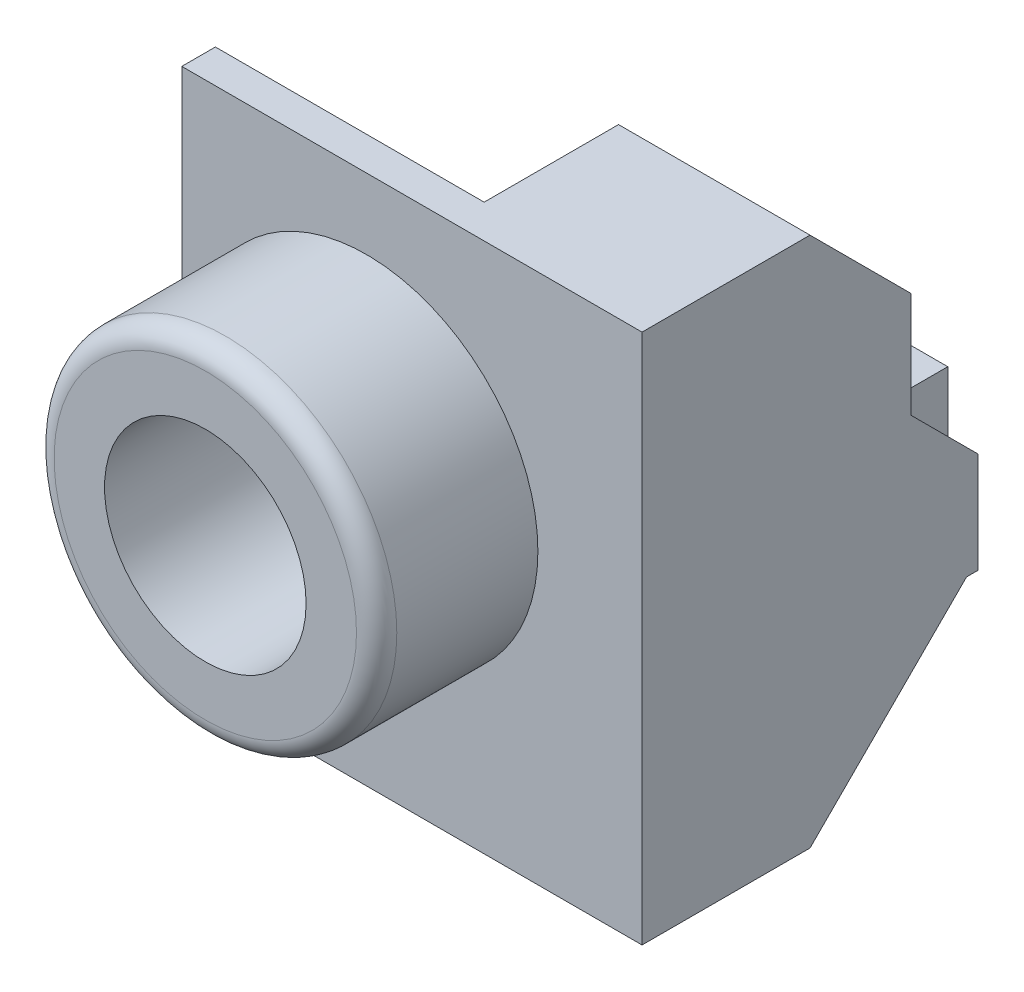
ISO-10303-21;
HEADER;
FILE_DESCRIPTION(('STEP AP214'),'2;1');
FILE_NAME('part.step','',(''),(''),'','','');
FILE_SCHEMA(('AUTOMOTIVE_DESIGN { 1 0 10303 214 1 1 1 1 }'));
ENDSEC;
DATA;
#1=APPLICATION_CONTEXT('core data for automotive mechanical design processes');
#2=APPLICATION_PROTOCOL_DEFINITION('international standard','automotive_design',2000,#1);
#3=PRODUCT_CONTEXT('',#1,'mechanical');
#4=PRODUCT('Part','Part','',(#3));
#5=PRODUCT_RELATED_PRODUCT_CATEGORY('part','',(#4));
#6=PRODUCT_DEFINITION_FORMATION('','',#4);
#7=PRODUCT_DEFINITION_CONTEXT('part definition',#1,'design');
#8=PRODUCT_DEFINITION('design','',#6,#7);
#9=PRODUCT_DEFINITION_SHAPE('','',#8);
#10=(LENGTH_UNIT() NAMED_UNIT(*) SI_UNIT(.MILLI.,.METRE.));
#11=(NAMED_UNIT(*) PLANE_ANGLE_UNIT() SI_UNIT($,.RADIAN.));
#12=(NAMED_UNIT(*) SI_UNIT($,.STERADIAN.) SOLID_ANGLE_UNIT());
#13=UNCERTAINTY_MEASURE_WITH_UNIT(LENGTH_MEASURE(1.E-05),#10,'distance_accuracy_value','');
#14=(GEOMETRIC_REPRESENTATION_CONTEXT(3) GLOBAL_UNCERTAINTY_ASSIGNED_CONTEXT((#13)) GLOBAL_UNIT_ASSIGNED_CONTEXT((#10,
#11,#12)) REPRESENTATION_CONTEXT('',''));
#15=CARTESIAN_POINT('',(0.,0.,0.));
#16=DIRECTION('',(0.,0.,1.));
#17=DIRECTION('',(1.,0.,0.));
#18=AXIS2_PLACEMENT_3D('',#15,#16,#17);
#19=CARTESIAN_POINT('',(0.,0.,-8.));
#20=DIRECTION('',(0.,0.,-1.));
#21=DIRECTION('',(-1.,0.,0.));
#22=AXIS2_PLACEMENT_3D('',#19,#20,#21);
#23=PLANE('',#22);
#24=DIRECTION('',(-1.,0.,0.));
#25=VECTOR('',#24,1.);
#26=CARTESIAN_POINT('',(2.91513169682799,-5.461534595663,-8.));
#27=LINE('',#26,#25);
#28=CARTESIAN_POINT('',(8.19999999999999,-5.461534595663,-8.));
#29=VERTEX_POINT('',#28);
#30=CARTESIAN_POINT('',(2.49999999999999,-5.461534595663,-8.));
#31=VERTEX_POINT('',#30);
#32=EDGE_CURVE('E183',#29,#31,#27,.T.);
#33=ORIENTED_EDGE('',*,*,#32,.T.);
#34=DIRECTION('',(0.,1.,0.));
#35=VECTOR('',#34,1.);
#36=CARTESIAN_POINT('',(2.49999999999999,0.680000000000005,-8.));
#37=LINE('',#36,#35);
#38=CARTESIAN_POINT('',(2.49999999999999,-2.31999999999999,-8.));
#39=VERTEX_POINT('',#38);
#40=EDGE_CURVE('E262',#31,#39,#37,.T.);
#41=ORIENTED_EDGE('',*,*,#40,.T.);
#42=DIRECTION('',(1.,0.,0.));
#43=VECTOR('',#42,1.);
#44=CARTESIAN_POINT('',(5.49999999999999,-2.31999999999999,-8.));
#45=LINE('',#44,#43);
#46=CARTESIAN_POINT('',(8.19999999999999,-2.32,-8.));
#47=VERTEX_POINT('',#46);
#48=EDGE_CURVE('E330',#39,#47,#45,.T.);
#49=ORIENTED_EDGE('',*,*,#48,.T.);
#50=DIRECTION('',(0.,1.,0.));
#51=VECTOR('',#50,1.);
#52=CARTESIAN_POINT('',(8.19999999999999,0.,-8.));
#53=LINE('',#52,#51);
#54=EDGE_CURVE('E188',#29,#47,#53,.T.);
#55=ORIENTED_EDGE('',*,*,#54,.F.);
#56=EDGE_LOOP('',(#33,#41,#49,#55));
#57=FACE_BOUND('',#56,.T.);
#58=ADVANCED_FACE('F44',(#57),#23,.T.);
#59=CARTESIAN_POINT('',(0.,0.,-1.));
#60=DIRECTION('',(0.,0.,-1.));
#61=DIRECTION('',(-1.,0.,0.));
#62=AXIS2_PLACEMENT_3D('',#59,#60,#61);
#63=PLANE('',#62);
#64=CARTESIAN_POINT('',(0.,-6.52,-1.));
#65=DIRECTION('',(0.,0.,1.));
#66=DIRECTION('',(1.,0.,0.));
#67=AXIS2_PLACEMENT_3D('',#64,#65,#66);
#68=CIRCLE('',#67,1.);
#69=CARTESIAN_POINT('',(0.999999999999993,-6.52,-1.));
#70=VERTEX_POINT('',#69);
#71=EDGE_CURVE('E272',#70,#70,#68,.T.);
#72=ORIENTED_EDGE('',*,*,#71,.T.);
#73=EDGE_LOOP('',(#72));
#74=FACE_BOUND('',#73,.T.);
#75=DIRECTION('',(1.,0.,0.));
#76=VECTOR('',#75,1.);
#77=CARTESIAN_POINT('',(5.49999999999999,0.680000000000005,-1.));
#78=LINE('',#77,#76);
#79=CARTESIAN_POINT('',(-5.5,0.680000000000005,-1.));
#80=VERTEX_POINT('',#79);
#81=CARTESIAN_POINT('',(2.49999999999999,0.680000000000005,-1.));
#82=VERTEX_POINT('',#81);
#83=EDGE_CURVE('E299',#80,#82,#78,.T.);
#84=ORIENTED_EDGE('',*,*,#83,.T.);
#85=DIRECTION('',(0.,1.,0.));
#86=VECTOR('',#85,1.);
#87=CARTESIAN_POINT('',(2.49999999999999,0.680000000000005,-1.));
#88=LINE('',#87,#86);
#89=CARTESIAN_POINT('',(2.49999999999999,-15.12,-1.));
#90=VERTEX_POINT('',#89);
#91=EDGE_CURVE('E248',#90,#82,#88,.T.);
#92=ORIENTED_EDGE('',*,*,#91,.F.);
#93=DIRECTION('',(-1.,0.,0.));
#94=VECTOR('',#93,1.);
#95=CARTESIAN_POINT('',(5.49999999999999,-15.12,-1.));
#96=LINE('',#95,#94);
#97=CARTESIAN_POINT('',(-5.5,-15.12,-1.));
#98=VERTEX_POINT('',#97);
#99=EDGE_CURVE('E292',#90,#98,#96,.T.);
#100=ORIENTED_EDGE('',*,*,#99,.T.);
#101=DIRECTION('',(0.,1.,0.));
#102=VECTOR('',#101,1.);
#103=CARTESIAN_POINT('',(-5.5,0.680000000000005,-1.));
#104=LINE('',#103,#102);
#105=EDGE_CURVE('E295',#98,#80,#104,.T.);
#106=ORIENTED_EDGE('',*,*,#105,.T.);
#107=EDGE_LOOP('',(#84,#92,#100,#106));
#108=FACE_BOUND('',#107,.T.);
#109=ADVANCED_FACE('F404',(#74,#108),#63,.T.);
#110=CARTESIAN_POINT('',(0.,-6.52,4.8));
#111=DIRECTION('',(0.,0.,-1.));
#112=DIRECTION('',(-1.,0.,0.));
#113=AXIS2_PLACEMENT_3D('',#110,#111,#112);
#114=CYLINDRICAL_SURFACE('',#113,5.1);
#115=CARTESIAN_POINT('',(0.,-6.52,4.2));
#116=DIRECTION('',(0.,0.,1.));
#117=DIRECTION('',(1.,0.,0.));
#118=AXIS2_PLACEMENT_3D('',#115,#116,#117);
#119=CIRCLE('',#118,5.1);
#120=CARTESIAN_POINT('',(5.09999999999999,-6.52,4.2));
#121=VERTEX_POINT('',#120);
#122=EDGE_CURVE('E326',#121,#121,#119,.F.);
#123=ORIENTED_EDGE('',*,*,#122,.T.);
#124=EDGE_LOOP('',(#123));
#125=FACE_BOUND('',#124,.T.);
#126=CARTESIAN_POINT('',(0.,-6.52,0.));
#127=DIRECTION('',(0.,0.,1.));
#128=DIRECTION('',(1.,0.,0.));
#129=AXIS2_PLACEMENT_3D('',#126,#127,#128);
#130=CIRCLE('',#129,5.1);
#131=CARTESIAN_POINT('',(5.09999999999999,-6.52,0.));
#132=VERTEX_POINT('',#131);
#133=EDGE_CURVE('E318',#132,#132,#130,.T.);
#134=ORIENTED_EDGE('',*,*,#133,.T.);
#135=EDGE_LOOP('',(#134));
#136=FACE_BOUND('',#135,.T.);
#137=ADVANCED_FACE('F440',(#125,#136),#114,.T.);
#138=CARTESIAN_POINT('',(0.,-6.52,4.8));
#139=DIRECTION('',(0.,0.,1.));
#140=DIRECTION('',(1.,0.,0.));
#141=AXIS2_PLACEMENT_3D('',#138,#139,#140);
#142=PLANE('',#141);
#143=CARTESIAN_POINT('',(0.,-6.52,4.8));
#144=DIRECTION('',(0.,0.,1.));
#145=DIRECTION('',(1.,0.,0.));
#146=AXIS2_PLACEMENT_3D('',#143,#144,#145);
#147=CIRCLE('',#146,3.);
#148=CARTESIAN_POINT('',(2.99999999999999,-6.52,4.8));
#149=VERTEX_POINT('',#148);
#150=EDGE_CURVE('E276',#149,#149,#147,.T.);
#151=ORIENTED_EDGE('',*,*,#150,.F.);
#152=EDGE_LOOP('',(#151));
#153=FACE_BOUND('',#152,.T.);
#154=CARTESIAN_POINT('',(0.,-6.52,4.8));
#155=DIRECTION('',(0.,0.,1.));
#156=DIRECTION('',(1.,0.,0.));
#157=AXIS2_PLACEMENT_3D('',#154,#155,#156);
#158=CIRCLE('',#157,4.5);
#159=CARTESIAN_POINT('',(4.49999999999999,-6.52,4.8));
#160=VERTEX_POINT('',#159);
#161=EDGE_CURVE('E322',#160,#160,#158,.T.);
#162=ORIENTED_EDGE('',*,*,#161,.T.);
#163=EDGE_LOOP('',(#162));
#164=FACE_BOUND('',#163,.T.);
#165=ADVANCED_FACE('F478',(#153,#164),#142,.T.);
#166=CARTESIAN_POINT('',(5.49999999999999,0.680000000000005,-1.));
#167=DIRECTION('',(-1.,0.,0.));
#168=DIRECTION('',(0.,-1.,0.));
#169=AXIS2_PLACEMENT_3D('',#166,#167,#168);
#170=PLANE('',#169);
#171=DIRECTION('',(0.,0.,-1.));
#172=VECTOR('',#171,1.);
#173=CARTESIAN_POINT('',(5.49999999999999,-7.46153459566299,-1.8));
#174=LINE('',#173,#172);
#175=CARTESIAN_POINT('',(5.49999999999999,-7.46153459566299,-10.));
#176=VERTEX_POINT('',#175);
#177=CARTESIAN_POINT('',(5.49999999999999,-7.46153459566299,-11.8));
#178=VERTEX_POINT('',#177);
#179=EDGE_CURVE('E245',#176,#178,#174,.T.);
#180=ORIENTED_EDGE('',*,*,#179,.F.);
#181=DIRECTION('',(0.,-1.,0.));
#182=VECTOR('',#181,1.);
#183=CARTESIAN_POINT('',(5.49999999999999,0.,-10.));
#184=LINE('',#183,#182);
#185=CARTESIAN_POINT('',(5.49999999999999,-10.461534595663,-10.));
#186=VERTEX_POINT('',#185);
#187=EDGE_CURVE('E61',#176,#186,#184,.T.);
#188=ORIENTED_EDGE('',*,*,#187,.T.);
#189=DIRECTION('',(0.,0.,-1.));
#190=VECTOR('',#189,1.);
#191=CARTESIAN_POINT('',(5.49999999999999,-10.461534595663,-1.8));
#192=LINE('',#191,#190);
#193=CARTESIAN_POINT('',(5.49999999999999,-10.461534595663,-11.8));
#194=VERTEX_POINT('',#193);
#195=EDGE_CURVE('E244',#186,#194,#192,.T.);
#196=ORIENTED_EDGE('',*,*,#195,.T.);
#197=DIRECTION('',(0.,-1.,0.));
#198=VECTOR('',#197,1.);
#199=CARTESIAN_POINT('',(5.49999999999999,-7.92564813239943,-11.8));
#200=LINE('',#199,#198);
#201=EDGE_CURVE('E284',#178,#194,#200,.T.);
#202=ORIENTED_EDGE('',*,*,#201,.F.);
#203=EDGE_LOOP('',(#180,#188,#196,#202));
#204=FACE_BOUND('',#203,.T.);
#205=ADVANCED_FACE('F432',(#204),#170,.F.);
#206=CARTESIAN_POINT('',(5.49999999999999,-15.12,-1.));
#207=DIRECTION('',(0.,1.,0.));
#208=DIRECTION('',(0.,0.,1.));
#209=AXIS2_PLACEMENT_3D('',#206,#207,#208);
#210=PLANE('',#209);
#211=DIRECTION('',(0.,0.,1.));
#212=VECTOR('',#211,1.);
#213=CARTESIAN_POINT('',(2.49999999999999,-15.12,-8.));
#214=LINE('',#213,#212);
#215=CARTESIAN_POINT('',(2.49999999999999,-15.12,-4.99999999999999));
#216=VERTEX_POINT('',#215);
#217=EDGE_CURVE('E268',#216,#90,#214,.T.);
#218=ORIENTED_EDGE('',*,*,#217,.F.);
#219=DIRECTION('',(1.,0.,0.));
#220=VECTOR('',#219,1.);
#221=CARTESIAN_POINT('',(5.49999999999999,-15.12,-4.99999999999999));
#222=LINE('',#221,#220);
#223=CARTESIAN_POINT('',(8.19999999999999,-15.12,-4.99999999999999));
#224=VERTEX_POINT('',#223);
#225=EDGE_CURVE('E344',#216,#224,#222,.T.);
#226=ORIENTED_EDGE('',*,*,#225,.T.);
#227=DIRECTION('',(0.,0.,-1.));
#228=VECTOR('',#227,1.);
#229=CARTESIAN_POINT('',(8.19999999999999,-15.12,0.));
#230=LINE('',#229,#228);
#231=CARTESIAN_POINT('',(8.19999999999999,-15.12,0.));
#232=VERTEX_POINT('',#231);
#233=EDGE_CURVE('E214',#232,#224,#230,.T.);
#234=ORIENTED_EDGE('',*,*,#233,.F.);
#235=DIRECTION('',(-1.,0.,0.));
#236=VECTOR('',#235,1.);
#237=CARTESIAN_POINT('',(5.49999999999999,-15.12,0.));
#238=LINE('',#237,#236);
#239=CARTESIAN_POINT('',(-5.5,-15.12,0.));
#240=VERTEX_POINT('',#239);
#241=EDGE_CURVE('E291',#232,#240,#238,.T.);
#242=ORIENTED_EDGE('',*,*,#241,.T.);
#243=DIRECTION('',(0.,0.,1.));
#244=VECTOR('',#243,1.);
#245=CARTESIAN_POINT('',(-5.5,-15.12,-1.));
#246=LINE('',#245,#244);
#247=EDGE_CURVE('E314',#98,#240,#246,.T.);
#248=ORIENTED_EDGE('',*,*,#247,.F.);
#249=ORIENTED_EDGE('',*,*,#99,.F.);
#250=EDGE_LOOP('',(#218,#226,#234,#242,#248,#249));
#251=FACE_BOUND('',#250,.T.);
#252=ADVANCED_FACE('F398',(#251),#210,.F.);
#253=CARTESIAN_POINT('',(-5.5,0.680000000000005,-1.));
#254=DIRECTION('',(1.,0.,0.));
#255=DIRECTION('',(0.,1.,0.));
#256=AXIS2_PLACEMENT_3D('',#253,#254,#255);
#257=PLANE('',#256);
#258=DIRECTION('',(0.,1.,0.));
#259=VECTOR('',#258,1.);
#260=CARTESIAN_POINT('',(-5.5,0.680000000000005,0.));
#261=LINE('',#260,#259);
#262=CARTESIAN_POINT('',(-5.5,0.680000000000005,0.));
#263=VERTEX_POINT('',#262);
#264=EDGE_CURVE('E306',#240,#263,#261,.T.);
#265=ORIENTED_EDGE('',*,*,#264,.T.);
#266=DIRECTION('',(0.,0.,1.));
#267=VECTOR('',#266,1.);
#268=CARTESIAN_POINT('',(-5.5,0.680000000000005,-1.));
#269=LINE('',#268,#267);
#270=EDGE_CURVE('E303',#80,#263,#269,.T.);
#271=ORIENTED_EDGE('',*,*,#270,.F.);
#272=ORIENTED_EDGE('',*,*,#105,.F.);
#273=ORIENTED_EDGE('',*,*,#247,.T.);
#274=EDGE_LOOP('',(#265,#271,#272,#273));
#275=FACE_BOUND('',#274,.T.);
#276=ADVANCED_FACE('F422',(#275),#257,.F.);
#277=CARTESIAN_POINT('',(5.49999999999999,0.680000000000005,-1.));
#278=DIRECTION('',(0.,-1.,0.));
#279=DIRECTION('',(0.,0.,-1.));
#280=AXIS2_PLACEMENT_3D('',#277,#278,#279);
#281=PLANE('',#280);
#282=DIRECTION('',(1.,0.,0.));
#283=VECTOR('',#282,1.);
#284=CARTESIAN_POINT('',(5.49999999999999,0.680000000000005,0.));
#285=LINE('',#284,#283);
#286=CARTESIAN_POINT('',(8.19999999999999,0.680000000000004,0.));
#287=VERTEX_POINT('',#286);
#288=EDGE_CURVE('E296',#263,#287,#285,.T.);
#289=ORIENTED_EDGE('',*,*,#288,.T.);
#290=DIRECTION('',(0.,0.,1.));
#291=VECTOR('',#290,1.);
#292=CARTESIAN_POINT('',(8.19999999999999,0.680000000000004,0.));
#293=LINE('',#292,#291);
#294=CARTESIAN_POINT('',(8.19999999999999,0.680000000000004,-4.99999999999999));
#295=VERTEX_POINT('',#294);
#296=EDGE_CURVE('E206',#295,#287,#293,.T.);
#297=ORIENTED_EDGE('',*,*,#296,.F.);
#298=DIRECTION('',(-1.,0.,0.));
#299=VECTOR('',#298,1.);
#300=CARTESIAN_POINT('',(2.49999999999999,0.680000000000005,-4.99999999999999));
#301=LINE('',#300,#299);
#302=CARTESIAN_POINT('',(2.49999999999999,0.680000000000005,-4.99999999999999));
#303=VERTEX_POINT('',#302);
#304=EDGE_CURVE('E347',#295,#303,#301,.T.);
#305=ORIENTED_EDGE('',*,*,#304,.T.);
#306=DIRECTION('',(0.,0.,1.));
#307=VECTOR('',#306,1.);
#308=CARTESIAN_POINT('',(2.49999999999999,0.680000000000005,-8.));
#309=LINE('',#308,#307);
#310=EDGE_CURVE('E261',#303,#82,#309,.T.);
#311=ORIENTED_EDGE('',*,*,#310,.T.);
#312=ORIENTED_EDGE('',*,*,#83,.F.);
#313=ORIENTED_EDGE('',*,*,#270,.T.);
#314=EDGE_LOOP('',(#289,#297,#305,#311,#312,#313));
#315=FACE_BOUND('',#314,.T.);
#316=ADVANCED_FACE('F409',(#315),#281,.F.);
#317=CARTESIAN_POINT('',(0.,0.,0.));
#318=DIRECTION('',(0.,0.,-1.));
#319=DIRECTION('',(-1.,0.,0.));
#320=AXIS2_PLACEMENT_3D('',#317,#318,#319);
#321=PLANE('',#320);
#322=ORIENTED_EDGE('',*,*,#133,.F.);
#323=EDGE_LOOP('',(#322));
#324=FACE_BOUND('',#323,.T.);
#325=ORIENTED_EDGE('',*,*,#241,.F.);
#326=DIRECTION('',(0.,-1.,0.));
#327=VECTOR('',#326,1.);
#328=CARTESIAN_POINT('',(8.19999999999999,0.,0.));
#329=LINE('',#328,#327);
#330=EDGE_CURVE('E210',#287,#232,#329,.T.);
#331=ORIENTED_EDGE('',*,*,#330,.F.);
#332=ORIENTED_EDGE('',*,*,#288,.F.);
#333=ORIENTED_EDGE('',*,*,#264,.F.);
#334=EDGE_LOOP('',(#325,#331,#332,#333));
#335=FACE_BOUND('',#334,.T.);
#336=ADVANCED_FACE('F420',(#324,#335),#321,.F.);
#337=CARTESIAN_POINT('',(4.41513169682799,-8.96153459566299,-11.8));
#338=DIRECTION('',(0.,0.,-1.));
#339=DIRECTION('',(-1.,0.,0.));
#340=AXIS2_PLACEMENT_3D('',#337,#338,#339);
#341=PLANE('',#340);
#342=ORIENTED_EDGE('',*,*,#201,.T.);
#343=DIRECTION('',(-1.,0.,0.));
#344=VECTOR('',#343,1.);
#345=CARTESIAN_POINT('',(5.49999999999999,-10.461534595663,-11.8));
#346=LINE('',#345,#344);
#347=CARTESIAN_POINT('',(2.91513169682799,-10.461534595663,-11.8));
#348=VERTEX_POINT('',#347);
#349=EDGE_CURVE('E176',#194,#348,#346,.T.);
#350=ORIENTED_EDGE('',*,*,#349,.T.);
#351=DIRECTION('',(0.,1.,0.));
#352=VECTOR('',#351,1.);
#353=CARTESIAN_POINT('',(2.91513169682799,-7.46153459566299,-11.8));
#354=LINE('',#353,#352);
#355=CARTESIAN_POINT('',(2.91513169682799,-7.46153459566299,-11.8));
#356=VERTEX_POINT('',#355);
#357=EDGE_CURVE('E236',#348,#356,#354,.T.);
#358=ORIENTED_EDGE('',*,*,#357,.T.);
#359=DIRECTION('',(1.,0.,0.));
#360=VECTOR('',#359,1.);
#361=CARTESIAN_POINT('',(5.49999999999999,-7.46153459566299,-11.8));
#362=LINE('',#361,#360);
#363=EDGE_CURVE('E240',#356,#178,#362,.T.);
#364=ORIENTED_EDGE('',*,*,#363,.T.);
#365=EDGE_LOOP('',(#342,#350,#358,#364));
#366=FACE_BOUND('',#365,.T.);
#367=ADVANCED_FACE('F469',(#366),#341,.T.);
#368=CARTESIAN_POINT('',(0.,-6.52,4.2));
#369=DIRECTION('',(0.,0.,1.));
#370=DIRECTION('',(1.,0.,0.));
#371=AXIS2_PLACEMENT_3D('',#368,#369,#370);
#372=TOROIDAL_SURFACE('',#371,4.5,0.6);
#373=ORIENTED_EDGE('',*,*,#122,.F.);
#374=EDGE_LOOP('',(#373));
#375=FACE_BOUND('',#374,.T.);
#376=ORIENTED_EDGE('',*,*,#161,.F.);
#377=EDGE_LOOP('',(#376));
#378=FACE_BOUND('',#377,.T.);
#379=ADVANCED_FACE('F467',(#375,#378),#372,.T.);
#380=CARTESIAN_POINT('',(0.,-6.52,0.));
#381=DIRECTION('',(0.,0.,1.));
#382=DIRECTION('',(1.,0.,0.));
#383=AXIS2_PLACEMENT_3D('',#380,#381,#382);
#384=CYLINDRICAL_SURFACE('',#383,3.);
#385=CARTESIAN_POINT('',(0.,-6.52,0.));
#386=DIRECTION('',(0.,0.,1.));
#387=DIRECTION('',(1.,0.,0.));
#388=AXIS2_PLACEMENT_3D('',#385,#386,#387);
#389=CIRCLE('',#388,3.);
#390=CARTESIAN_POINT('',(2.99999999999999,-6.52,0.));
#391=VERTEX_POINT('',#390);
#392=EDGE_CURVE('E280',#391,#391,#389,.T.);
#393=ORIENTED_EDGE('',*,*,#392,.F.);
#394=EDGE_LOOP('',(#393));
#395=FACE_BOUND('',#394,.T.);
#396=ORIENTED_EDGE('',*,*,#150,.T.);
#397=EDGE_LOOP('',(#396));
#398=FACE_BOUND('',#397,.T.);
#399=ADVANCED_FACE('F463',(#395,#398),#384,.F.);
#400=CARTESIAN_POINT('',(0.,-6.52,0.));
#401=DIRECTION('',(0.,0.,1.));
#402=DIRECTION('',(1.,0.,0.));
#403=AXIS2_PLACEMENT_3D('',#400,#401,#402);
#404=PLANE('',#403);
#405=CARTESIAN_POINT('',(0.,-6.52,0.));
#406=DIRECTION('',(0.,0.,1.));
#407=DIRECTION('',(1.,0.,0.));
#408=AXIS2_PLACEMENT_3D('',#405,#406,#407);
#409=CIRCLE('',#408,1.);
#410=CARTESIAN_POINT('',(0.999999999999993,-6.52,0.));
#411=VERTEX_POINT('',#410);
#412=EDGE_CURVE('E271',#411,#411,#409,.T.);
#413=ORIENTED_EDGE('',*,*,#412,.F.);
#414=EDGE_LOOP('',(#413));
#415=FACE_BOUND('',#414,.T.);
#416=ORIENTED_EDGE('',*,*,#392,.T.);
#417=EDGE_LOOP('',(#416));
#418=FACE_BOUND('',#417,.T.);
#419=ADVANCED_FACE('F457',(#415,#418),#404,.T.);
#420=CARTESIAN_POINT('',(0.,-6.52,-1.));
#421=DIRECTION('',(0.,0.,1.));
#422=DIRECTION('',(1.,0.,0.));
#423=AXIS2_PLACEMENT_3D('',#420,#421,#422);
#424=CYLINDRICAL_SURFACE('',#423,1.);
#425=ORIENTED_EDGE('',*,*,#71,.F.);
#426=EDGE_LOOP('',(#425));
#427=FACE_BOUND('',#426,.T.);
#428=ORIENTED_EDGE('',*,*,#412,.T.);
#429=EDGE_LOOP('',(#428));
#430=FACE_BOUND('',#429,.T.);
#431=ADVANCED_FACE('F452',(#427,#430),#424,.F.);
#432=CARTESIAN_POINT('',(2.49999999999999,0.680000000000005,-8.));
#433=DIRECTION('',(1.,0.,0.));
#434=DIRECTION('',(0.,1.,0.));
#435=AXIS2_PLACEMENT_3D('',#432,#433,#434);
#436=PLANE('',#435);
#437=CARTESIAN_POINT('',(2.49999999999999,-12.12,-8.));
#438=VERTEX_POINT('',#437);
#439=CARTESIAN_POINT('',(2.49999999999999,-12.119934595663,-8.));
#440=VERTEX_POINT('',#439);
#441=EDGE_CURVE('E257',#438,#440,#37,.T.);
#442=ORIENTED_EDGE('',*,*,#441,.F.);
#443=DIRECTION('',(0.,-0.707106781186546,0.707106781186549));
#444=VECTOR('',#443,1.);
#445=CARTESIAN_POINT('',(2.49999999999999,-12.12,-8.));
#446=LINE('',#445,#444);
#447=EDGE_CURVE('E341',#438,#216,#446,.T.);
#448=ORIENTED_EDGE('',*,*,#447,.T.);
#449=ORIENTED_EDGE('',*,*,#217,.T.);
#450=ORIENTED_EDGE('',*,*,#91,.T.);
#451=ORIENTED_EDGE('',*,*,#310,.F.);
#452=DIRECTION('',(0.,-0.707106781186546,-0.707106781186549));
#453=VECTOR('',#452,1.);
#454=CARTESIAN_POINT('',(2.49999999999999,-2.31999999999999,-8.));
#455=LINE('',#454,#453);
#456=EDGE_CURVE('E337',#303,#39,#455,.T.);
#457=ORIENTED_EDGE('',*,*,#456,.T.);
#458=ORIENTED_EDGE('',*,*,#40,.F.);
#459=DIRECTION('',(0.,0.707106781186543,0.707106781186552));
#460=VECTOR('',#459,1.);
#461=CARTESIAN_POINT('',(2.49999999999999,-2.39076729783153,-4.9292327021685));
#462=LINE('',#461,#460);
#463=CARTESIAN_POINT('',(2.49999999999999,-7.04640289883501,-9.58486830317203));
#464=VERTEX_POINT('',#463);
#465=EDGE_CURVE('E54',#31,#464,#462,.F.);
#466=ORIENTED_EDGE('',*,*,#465,.T.);
#467=DIRECTION('',(0.,1.,0.));
#468=VECTOR('',#467,1.);
#469=CARTESIAN_POINT('',(2.49999999999999,0.680000000000004,-9.58486830317203));
#470=LINE('',#469,#468);
#471=CARTESIAN_POINT('',(2.49999999999999,-10.535066292491,-9.58486830317203));
#472=VERTEX_POINT('',#471);
#473=EDGE_CURVE('E69',#464,#472,#470,.F.);
#474=ORIENTED_EDGE('',*,*,#473,.T.);
#475=DIRECTION('',(0.,0.707106781186545,-0.707106781186551));
#476=VECTOR('',#475,1.);
#477=CARTESIAN_POINT('',(2.49999999999999,-5.71996729783154,-14.3999672978315));
#478=LINE('',#477,#476);
#479=EDGE_CURVE('E11',#440,#472,#478,.T.);
#480=ORIENTED_EDGE('',*,*,#479,.F.);
#481=EDGE_LOOP('',(#442,#448,#449,#450,#451,#457,#458,#466,#474,#480));
#482=FACE_BOUND('',#481,.T.);
#483=ADVANCED_FACE('F379',(#482),#436,.F.);
#484=ORIENTED_EDGE('',*,*,#441,.T.);
#485=DIRECTION('',(1.,0.,0.));
#486=VECTOR('',#485,1.);
#487=CARTESIAN_POINT('',(5.49999999999999,-12.119934595663,-8.));
#488=LINE('',#487,#486);
#489=CARTESIAN_POINT('',(8.19999999999999,-12.119934595663,-8.));
#490=VERTEX_POINT('',#489);
#491=EDGE_CURVE('E353',#440,#490,#488,.T.);
#492=ORIENTED_EDGE('',*,*,#491,.T.);
#493=DIRECTION('',(0.,1.,0.));
#494=VECTOR('',#493,1.);
#495=CARTESIAN_POINT('',(8.19999999999999,0.,-8.));
#496=LINE('',#495,#494);
#497=CARTESIAN_POINT('',(8.19999999999999,-12.12,-8.));
#498=VERTEX_POINT('',#497);
#499=EDGE_CURVE('E222',#498,#490,#496,.T.);
#500=ORIENTED_EDGE('',*,*,#499,.F.);
#501=DIRECTION('',(-1.,0.,0.));
#502=VECTOR('',#501,1.);
#503=CARTESIAN_POINT('',(2.49999999999999,-12.12,-8.));
#504=LINE('',#503,#502);
#505=EDGE_CURVE('E333',#498,#438,#504,.T.);
#506=ORIENTED_EDGE('',*,*,#505,.T.);
#507=EDGE_LOOP('',(#484,#492,#500,#506));
#508=FACE_BOUND('',#507,.T.);
#509=ADVANCED_FACE('F388',(#508),#23,.T.);
#510=CARTESIAN_POINT('',(0.,-12.12,-8.));
#511=DIRECTION('',(0.,-0.707106781186549,-0.707106781186546));
#512=DIRECTION('',(1.,0.,0.));
#513=AXIS2_PLACEMENT_3D('',#510,#511,#512);
#514=PLANE('',#513);
#515=ORIENTED_EDGE('',*,*,#505,.F.);
#516=DIRECTION('',(0.,0.707106781186546,-0.707106781186549));
#517=VECTOR('',#516,1.);
#518=CARTESIAN_POINT('',(8.19999999999999,-10.06,-10.06));
#519=LINE('',#518,#517);
#520=EDGE_CURVE('E218',#224,#498,#519,.T.);
#521=ORIENTED_EDGE('',*,*,#520,.F.);
#522=ORIENTED_EDGE('',*,*,#225,.F.);
#523=ORIENTED_EDGE('',*,*,#447,.F.);
#524=EDGE_LOOP('',(#515,#521,#522,#523));
#525=FACE_BOUND('',#524,.T.);
#526=ADVANCED_FACE('F392',(#525),#514,.T.);
#527=CARTESIAN_POINT('',(0.,-2.31999999999999,-8.));
#528=DIRECTION('',(0.,0.707106781186549,-0.707106781186546));
#529=DIRECTION('',(-1.,0.,0.));
#530=AXIS2_PLACEMENT_3D('',#527,#528,#529);
#531=PLANE('',#530);
#532=ORIENTED_EDGE('',*,*,#456,.F.);
#533=ORIENTED_EDGE('',*,*,#304,.F.);
#534=DIRECTION('',(0.,0.707106781186546,0.707106781186549));
#535=VECTOR('',#534,1.);
#536=CARTESIAN_POINT('',(8.19999999999999,2.84,-2.83999999999999));
#537=LINE('',#536,#535);
#538=EDGE_CURVE('E202',#47,#295,#537,.T.);
#539=ORIENTED_EDGE('',*,*,#538,.F.);
#540=ORIENTED_EDGE('',*,*,#48,.F.);
#541=EDGE_LOOP('',(#532,#533,#539,#540));
#542=FACE_BOUND('',#541,.T.);
#543=ADVANCED_FACE('F415',(#542),#531,.T.);
#544=CARTESIAN_POINT('',(5.49999999999999,-7.46153459566299,-1.8));
#545=DIRECTION('',(0.,1.,0.));
#546=DIRECTION('',(0.,0.,1.));
#547=AXIS2_PLACEMENT_3D('',#544,#545,#546);
#548=PLANE('',#547);
#549=DIRECTION('',(0.,0.,-1.));
#550=VECTOR('',#549,1.);
#551=CARTESIAN_POINT('',(2.91513169682799,-7.46153459566299,-1.8));
#552=LINE('',#551,#550);
#553=CARTESIAN_POINT('',(2.91513169682799,-7.46153459566299,-10.));
#554=VERTEX_POINT('',#553);
#555=EDGE_CURVE('E249',#554,#356,#552,.T.);
#556=ORIENTED_EDGE('',*,*,#555,.F.);
#557=DIRECTION('',(1.,0.,0.));
#558=VECTOR('',#557,1.);
#559=CARTESIAN_POINT('',(5.49999999999999,-7.46153459566299,-10.));
#560=LINE('',#559,#558);
#561=EDGE_CURVE('E356',#554,#176,#560,.T.);
#562=ORIENTED_EDGE('',*,*,#561,.T.);
#563=ORIENTED_EDGE('',*,*,#179,.T.);
#564=ORIENTED_EDGE('',*,*,#363,.F.);
#565=EDGE_LOOP('',(#556,#562,#563,#564));
#566=FACE_BOUND('',#565,.T.);
#567=ADVANCED_FACE('F500',(#566),#548,.T.);
#568=CARTESIAN_POINT('',(2.91513169682799,-7.46153459566299,-1.8));
#569=DIRECTION('',(-1.,0.,0.));
#570=DIRECTION('',(0.,0.,1.));
#571=AXIS2_PLACEMENT_3D('',#568,#569,#570);
#572=PLANE('',#571);
#573=DIRECTION('',(0.,0.,-1.));
#574=VECTOR('',#573,1.);
#575=CARTESIAN_POINT('',(2.91513169682799,-10.461534595663,-1.8));
#576=LINE('',#575,#574);
#577=CARTESIAN_POINT('',(2.91513169682799,-10.461534595663,-10.));
#578=VERTEX_POINT('',#577);
#579=EDGE_CURVE('E252',#578,#348,#576,.T.);
#580=ORIENTED_EDGE('',*,*,#579,.F.);
#581=DIRECTION('',(0.,1.,0.));
#582=VECTOR('',#581,1.);
#583=CARTESIAN_POINT('',(2.91513169682799,-5.461534595663,-10.));
#584=LINE('',#583,#582);
#585=EDGE_CURVE('E361',#578,#554,#584,.T.);
#586=ORIENTED_EDGE('',*,*,#585,.T.);
#587=ORIENTED_EDGE('',*,*,#555,.T.);
#588=ORIENTED_EDGE('',*,*,#357,.F.);
#589=EDGE_LOOP('',(#580,#586,#587,#588));
#590=FACE_BOUND('',#589,.T.);
#591=ADVANCED_FACE('F523',(#590),#572,.T.);
#592=CARTESIAN_POINT('',(5.49999999999999,-10.461534595663,-1.8));
#593=DIRECTION('',(0.,-1.,0.));
#594=DIRECTION('',(0.,0.,-1.));
#595=AXIS2_PLACEMENT_3D('',#592,#593,#594);
#596=PLANE('',#595);
#597=ORIENTED_EDGE('',*,*,#195,.F.);
#598=DIRECTION('',(-1.,0.,0.));
#599=VECTOR('',#598,1.);
#600=CARTESIAN_POINT('',(8.19999999999999,-10.461534595663,-10.));
#601=LINE('',#600,#599);
#602=CARTESIAN_POINT('',(8.19999999999999,-10.461534595663,-10.));
#603=VERTEX_POINT('',#602);
#604=EDGE_CURVE('E177',#603,#186,#601,.T.);
#605=ORIENTED_EDGE('',*,*,#604,.F.);
#606=DIRECTION('',(0.,0.,-1.));
#607=VECTOR('',#606,1.);
#608=CARTESIAN_POINT('',(8.19999999999999,-10.461534595663,0.));
#609=LINE('',#608,#607);
#610=CARTESIAN_POINT('',(8.19999999999999,-10.461534595663,-9.65840000000001));
#611=VERTEX_POINT('',#610);
#612=EDGE_CURVE('E193',#611,#603,#609,.T.);
#613=ORIENTED_EDGE('',*,*,#612,.F.);
#614=DIRECTION('',(-1.,0.,0.));
#615=VECTOR('',#614,1.);
#616=CARTESIAN_POINT('',(2.91513169682799,-10.461534595663,-9.65840000000001));
#617=LINE('',#616,#615);
#618=CARTESIAN_POINT('',(2.57353169682796,-10.461534595663,-9.65840000000001));
#619=VERTEX_POINT('',#618);
#620=EDGE_CURVE('E350',#611,#619,#617,.T.);
#621=ORIENTED_EDGE('',*,*,#620,.T.);
#622=DIRECTION('',(-0.707106781186544,0.,0.707106781186551));
#623=VECTOR('',#622,1.);
#624=CARTESIAN_POINT('',(2.91513169682799,-10.461534595663,-10.));
#625=LINE('',#624,#623);
#626=EDGE_CURVE('E374',#619,#578,#625,.F.);
#627=ORIENTED_EDGE('',*,*,#626,.T.);
#628=ORIENTED_EDGE('',*,*,#579,.T.);
#629=ORIENTED_EDGE('',*,*,#349,.F.);
#630=EDGE_LOOP('',(#597,#605,#613,#621,#627,#628,#629));
#631=FACE_BOUND('',#630,.T.);
#632=ADVANCED_FACE('F505',(#631),#596,.T.);
#633=CARTESIAN_POINT('',(5.49999999999999,-10.461534595663,-9.65840000000001));
#634=DIRECTION('',(0.,-0.707106781186551,-0.707106781186545));
#635=DIRECTION('',(1.,0.,0.));
#636=AXIS2_PLACEMENT_3D('',#633,#634,#635);
#637=PLANE('',#636);
#638=ORIENTED_EDGE('',*,*,#620,.F.);
#639=DIRECTION('',(0.,0.707106781186545,-0.707106781186551));
#640=VECTOR('',#639,1.);
#641=CARTESIAN_POINT('',(8.19999999999999,-10.0599672978315,-10.0599672978315));
#642=LINE('',#641,#640);
#643=EDGE_CURVE('E226',#490,#611,#642,.T.);
#644=ORIENTED_EDGE('',*,*,#643,.F.);
#645=ORIENTED_EDGE('',*,*,#491,.F.);
#646=ORIENTED_EDGE('',*,*,#479,.T.);
#647=DIRECTION('',(0.577350269189624,0.577350269189625,-0.577350269189629));
#648=VECTOR('',#647,1.);
#649=CARTESIAN_POINT('',(3.54902113121863,-9.48604516127232,-10.6338894343907));
#650=LINE('',#649,#648);
#651=EDGE_CURVE('E370',#472,#619,#650,.T.);
#652=ORIENTED_EDGE('',*,*,#651,.T.);
#653=EDGE_LOOP('',(#638,#644,#645,#646,#652));
#654=FACE_BOUND('',#653,.T.);
#655=ADVANCED_FACE('F385',(#654),#637,.T.);
#656=CARTESIAN_POINT('',(5.49999999999999,-7.46153459566299,-10.));
#657=DIRECTION('',(0.,0.707106781186552,-0.707106781186543));
#658=DIRECTION('',(-1.,0.,0.));
#659=AXIS2_PLACEMENT_3D('',#656,#657,#658);
#660=PLANE('',#659);
#661=ORIENTED_EDGE('',*,*,#561,.F.);
#662=DIRECTION('',(-0.577350269189624,0.577350269189623,0.57735026918963));
#663=VECTOR('',#662,1.);
#664=CARTESIAN_POINT('',(3.77675446455197,-8.32315736338699,-10.861622767724));
#665=LINE('',#664,#663);
#666=EDGE_CURVE('E365',#554,#464,#665,.T.);
#667=ORIENTED_EDGE('',*,*,#666,.T.);
#668=ORIENTED_EDGE('',*,*,#465,.F.);
#669=ORIENTED_EDGE('',*,*,#32,.F.);
#670=DIRECTION('',(0.,0.707106781186543,0.707106781186552));
#671=VECTOR('',#670,1.);
#672=CARTESIAN_POINT('',(8.19999999999999,1.26923270216847,-1.26923270216845));
#673=LINE('',#672,#671);
#674=CARTESIAN_POINT('',(8.19999999999999,-7.46153459566299,-10.));
#675=VERTEX_POINT('',#674);
#676=EDGE_CURVE('E180',#675,#29,#673,.T.);
#677=ORIENTED_EDGE('',*,*,#676,.F.);
#678=DIRECTION('',(-1.,0.,0.));
#679=VECTOR('',#678,1.);
#680=CARTESIAN_POINT('',(8.19999999999999,-7.46153459566299,-10.));
#681=LINE('',#680,#679);
#682=EDGE_CURVE('E167',#675,#176,#681,.T.);
#683=ORIENTED_EDGE('',*,*,#682,.T.);
#684=EDGE_LOOP('',(#661,#667,#668,#669,#677,#683));
#685=FACE_BOUND('',#684,.T.);
#686=ADVANCED_FACE('F181',(#685),#660,.T.);
#687=CARTESIAN_POINT('',(2.91513169682799,-7.46153459566299,-10.));
#688=DIRECTION('',(-0.707106781186551,0.,-0.707106781186544));
#689=DIRECTION('',(0.,-1.,0.));
#690=AXIS2_PLACEMENT_3D('',#687,#688,#689);
#691=PLANE('',#690);
#692=ORIENTED_EDGE('',*,*,#651,.F.);
#693=ORIENTED_EDGE('',*,*,#473,.F.);
#694=ORIENTED_EDGE('',*,*,#666,.F.);
#695=ORIENTED_EDGE('',*,*,#585,.F.);
#696=ORIENTED_EDGE('',*,*,#626,.F.);
#697=EDGE_LOOP('',(#692,#693,#694,#695,#696));
#698=FACE_BOUND('',#697,.T.);
#699=ADVANCED_FACE('F47',(#698),#691,.T.);
#700=CARTESIAN_POINT('',(8.19999999999999,0.,-10.));
#701=DIRECTION('',(0.,0.,-1.));
#702=DIRECTION('',(-1.,0.,0.));
#703=AXIS2_PLACEMENT_3D('',#700,#701,#702);
#704=PLANE('',#703);
#705=ORIENTED_EDGE('',*,*,#187,.F.);
#706=ORIENTED_EDGE('',*,*,#682,.F.);
#707=DIRECTION('',(0.,-1.,0.));
#708=VECTOR('',#707,1.);
#709=CARTESIAN_POINT('',(8.19999999999999,0.,-10.));
#710=LINE('',#709,#708);
#711=EDGE_CURVE('E172',#675,#603,#710,.T.);
#712=ORIENTED_EDGE('',*,*,#711,.T.);
#713=ORIENTED_EDGE('',*,*,#604,.T.);
#714=EDGE_LOOP('',(#705,#706,#712,#713));
#715=FACE_BOUND('',#714,.T.);
#716=ADVANCED_FACE('F169',(#715),#704,.T.);
#717=CARTESIAN_POINT('',(8.19999999999999,0.,0.));
#718=DIRECTION('',(1.,0.,0.));
#719=DIRECTION('',(0.,1.,0.));
#720=AXIS2_PLACEMENT_3D('',#717,#718,#719);
#721=PLANE('',#720);
#722=ORIENTED_EDGE('',*,*,#711,.F.);
#723=ORIENTED_EDGE('',*,*,#676,.T.);
#724=ORIENTED_EDGE('',*,*,#54,.T.);
#725=ORIENTED_EDGE('',*,*,#538,.T.);
#726=ORIENTED_EDGE('',*,*,#296,.T.);
#727=ORIENTED_EDGE('',*,*,#330,.T.);
#728=ORIENTED_EDGE('',*,*,#233,.T.);
#729=ORIENTED_EDGE('',*,*,#520,.T.);
#730=ORIENTED_EDGE('',*,*,#499,.T.);
#731=ORIENTED_EDGE('',*,*,#643,.T.);
#732=ORIENTED_EDGE('',*,*,#612,.T.);
#733=EDGE_LOOP('',(#722,#723,#724,#725,#726,#727,#728,#729,#730,#731,#732));
#734=FACE_BOUND('',#733,.T.);
#735=ADVANCED_FACE('F190',(#734),#721,.T.);
#736=CLOSED_SHELL('',(#58,#109,#137,#165,#205,#252,#276,#316,#336,#367,#379,#399,#419,#431,#483,
#509,#526,#543,#567,#591,#632,#655,#686,#699,#716,#735));
#737=MANIFOLD_SOLID_BREP('B2',#736);
#738=ADVANCED_BREP_SHAPE_REPRESENTATION('',(#18,#737),#14);
#739=SHAPE_DEFINITION_REPRESENTATION(#9,#738);
ENDSEC;
END-ISO-10303-21;
